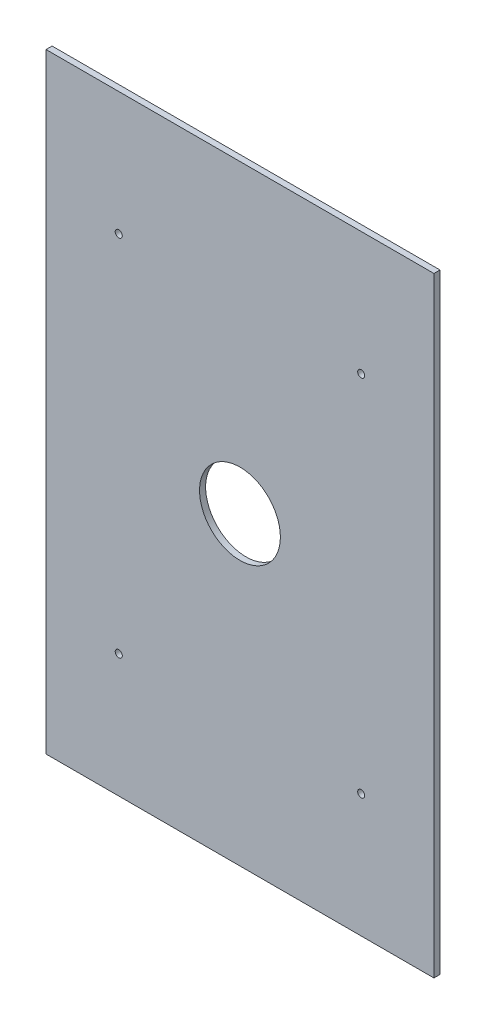
ISO-10303-21;
HEADER;
FILE_DESCRIPTION(('STEP AP214'),'2;1');
FILE_NAME('part.step','',(''),(''),'','','');
FILE_SCHEMA(('AUTOMOTIVE_DESIGN { 1 0 10303 214 1 1 1 1 }'));
ENDSEC;
DATA;
#1=APPLICATION_CONTEXT('core data for automotive mechanical design processes');
#2=APPLICATION_PROTOCOL_DEFINITION('international standard','automotive_design',2000,#1);
#3=PRODUCT_CONTEXT('',#1,'mechanical');
#4=PRODUCT('Part','Part','',(#3));
#5=PRODUCT_RELATED_PRODUCT_CATEGORY('part','',(#4));
#6=PRODUCT_DEFINITION_FORMATION('','',#4);
#7=PRODUCT_DEFINITION_CONTEXT('part definition',#1,'design');
#8=PRODUCT_DEFINITION('design','',#6,#7);
#9=PRODUCT_DEFINITION_SHAPE('','',#8);
#10=(LENGTH_UNIT() NAMED_UNIT(*) SI_UNIT(.MILLI.,.METRE.));
#11=(NAMED_UNIT(*) PLANE_ANGLE_UNIT() SI_UNIT($,.RADIAN.));
#12=(NAMED_UNIT(*) SI_UNIT($,.STERADIAN.) SOLID_ANGLE_UNIT());
#13=UNCERTAINTY_MEASURE_WITH_UNIT(LENGTH_MEASURE(1.E-05),#10,'distance_accuracy_value','');
#14=(GEOMETRIC_REPRESENTATION_CONTEXT(3) GLOBAL_UNCERTAINTY_ASSIGNED_CONTEXT((#13)) GLOBAL_UNIT_ASSIGNED_CONTEXT((#10,
#11,#12)) REPRESENTATION_CONTEXT('',''));
#15=CARTESIAN_POINT('',(0.,0.,0.));
#16=DIRECTION('',(0.,0.,1.));
#17=DIRECTION('',(1.,0.,0.));
#18=AXIS2_PLACEMENT_3D('',#15,#16,#17);
#19=CARTESIAN_POINT('',(0.,604.,6.));
#20=DIRECTION('',(1.,0.,0.));
#21=DIRECTION('',(0.,0.,-1.));
#22=AXIS2_PLACEMENT_3D('',#19,#20,#21);
#23=PLANE('',#22);
#24=DIRECTION('',(0.,-1.,0.));
#25=VECTOR('',#24,1.);
#26=CARTESIAN_POINT('',(0.,604.,0.));
#27=LINE('',#26,#25);
#28=CARTESIAN_POINT('',(0.,604.,0.));
#29=VERTEX_POINT('',#28);
#30=CARTESIAN_POINT('',(0.,0.,0.));
#31=VERTEX_POINT('',#30);
#32=EDGE_CURVE('E102',#29,#31,#27,.T.);
#33=ORIENTED_EDGE('',*,*,#32,.T.);
#34=DIRECTION('',(0.,0.,-1.));
#35=VECTOR('',#34,1.);
#36=CARTESIAN_POINT('',(0.,0.,6.));
#37=LINE('',#36,#35);
#38=CARTESIAN_POINT('',(0.,0.,6.));
#39=VERTEX_POINT('',#38);
#40=EDGE_CURVE('E11',#39,#31,#37,.T.);
#41=ORIENTED_EDGE('',*,*,#40,.F.);
#42=DIRECTION('',(0.,-1.,0.));
#43=VECTOR('',#42,1.);
#44=CARTESIAN_POINT('',(0.,604.,6.));
#45=LINE('',#44,#43);
#46=CARTESIAN_POINT('',(0.,604.,6.));
#47=VERTEX_POINT('',#46);
#48=EDGE_CURVE('E90',#47,#39,#45,.T.);
#49=ORIENTED_EDGE('',*,*,#48,.F.);
#50=DIRECTION('',(0.,0.,-1.));
#51=VECTOR('',#50,1.);
#52=CARTESIAN_POINT('',(0.,604.,6.));
#53=LINE('',#52,#51);
#54=EDGE_CURVE('E98',#47,#29,#53,.T.);
#55=ORIENTED_EDGE('',*,*,#54,.T.);
#56=EDGE_LOOP('',(#33,#41,#49,#55));
#57=FACE_BOUND('',#56,.T.);
#58=ADVANCED_FACE('F39',(#57),#23,.F.);
#59=CARTESIAN_POINT('',(0.,0.,6.));
#60=DIRECTION('',(0.,1.,0.));
#61=DIRECTION('',(0.,0.,1.));
#62=AXIS2_PLACEMENT_3D('',#59,#60,#61);
#63=PLANE('',#62);
#64=DIRECTION('',(1.,0.,0.));
#65=VECTOR('',#64,1.);
#66=CARTESIAN_POINT('',(0.,0.,0.));
#67=LINE('',#66,#65);
#68=CARTESIAN_POINT('',(384.,0.,0.));
#69=VERTEX_POINT('',#68);
#70=EDGE_CURVE('E94',#31,#69,#67,.T.);
#71=ORIENTED_EDGE('',*,*,#70,.T.);
#72=DIRECTION('',(0.,0.,-1.));
#73=VECTOR('',#72,1.);
#74=CARTESIAN_POINT('',(384.,0.,6.));
#75=LINE('',#74,#73);
#76=CARTESIAN_POINT('',(384.,0.,6.));
#77=VERTEX_POINT('',#76);
#78=EDGE_CURVE('E47',#77,#69,#75,.T.);
#79=ORIENTED_EDGE('',*,*,#78,.F.);
#80=DIRECTION('',(1.,0.,0.));
#81=VECTOR('',#80,1.);
#82=CARTESIAN_POINT('',(0.,0.,6.));
#83=LINE('',#82,#81);
#84=EDGE_CURVE('E85',#39,#77,#83,.T.);
#85=ORIENTED_EDGE('',*,*,#84,.F.);
#86=ORIENTED_EDGE('',*,*,#40,.T.);
#87=EDGE_LOOP('',(#71,#79,#85,#86));
#88=FACE_BOUND('',#87,.T.);
#89=ADVANCED_FACE('F93',(#88),#63,.F.);
#90=CARTESIAN_POINT('',(384.,0.,6.));
#91=DIRECTION('',(-1.,0.,0.));
#92=DIRECTION('',(0.,0.,1.));
#93=AXIS2_PLACEMENT_3D('',#90,#91,#92);
#94=PLANE('',#93);
#95=DIRECTION('',(0.,1.,0.));
#96=VECTOR('',#95,1.);
#97=CARTESIAN_POINT('',(384.,0.,0.));
#98=LINE('',#97,#96);
#99=CARTESIAN_POINT('',(384.,604.,0.));
#100=VERTEX_POINT('',#99);
#101=EDGE_CURVE('E72',#69,#100,#98,.T.);
#102=ORIENTED_EDGE('',*,*,#101,.T.);
#103=DIRECTION('',(0.,0.,-1.));
#104=VECTOR('',#103,1.);
#105=CARTESIAN_POINT('',(384.,604.,6.));
#106=LINE('',#105,#104);
#107=CARTESIAN_POINT('',(384.,604.,6.));
#108=VERTEX_POINT('',#107);
#109=EDGE_CURVE('E95',#108,#100,#106,.T.);
#110=ORIENTED_EDGE('',*,*,#109,.F.);
#111=DIRECTION('',(0.,1.,0.));
#112=VECTOR('',#111,1.);
#113=CARTESIAN_POINT('',(384.,0.,6.));
#114=LINE('',#113,#112);
#115=EDGE_CURVE('E88',#77,#108,#114,.T.);
#116=ORIENTED_EDGE('',*,*,#115,.F.);
#117=ORIENTED_EDGE('',*,*,#78,.T.);
#118=EDGE_LOOP('',(#102,#110,#116,#117));
#119=FACE_BOUND('',#118,.T.);
#120=ADVANCED_FACE('F96',(#119),#94,.F.);
#121=CARTESIAN_POINT('',(384.,604.,6.));
#122=DIRECTION('',(0.,-1.,0.));
#123=DIRECTION('',(0.,0.,-1.));
#124=AXIS2_PLACEMENT_3D('',#121,#122,#123);
#125=PLANE('',#124);
#126=DIRECTION('',(-1.,0.,0.));
#127=VECTOR('',#126,1.);
#128=CARTESIAN_POINT('',(384.,604.,0.));
#129=LINE('',#128,#127);
#130=EDGE_CURVE('E78',#100,#29,#129,.T.);
#131=ORIENTED_EDGE('',*,*,#130,.T.);
#132=ORIENTED_EDGE('',*,*,#54,.F.);
#133=DIRECTION('',(-1.,0.,0.));
#134=VECTOR('',#133,1.);
#135=CARTESIAN_POINT('',(384.,604.,6.));
#136=LINE('',#135,#134);
#137=EDGE_CURVE('E55',#108,#47,#136,.T.);
#138=ORIENTED_EDGE('',*,*,#137,.F.);
#139=ORIENTED_EDGE('',*,*,#109,.T.);
#140=EDGE_LOOP('',(#131,#132,#138,#139));
#141=FACE_BOUND('',#140,.T.);
#142=ADVANCED_FACE('F110',(#141),#125,.F.);
#143=CARTESIAN_POINT('',(0.,0.,6.));
#144=DIRECTION('',(0.,0.,1.));
#145=DIRECTION('',(1.,0.,0.));
#146=AXIS2_PLACEMENT_3D('',#143,#144,#145);
#147=PLANE('',#146);
#148=CARTESIAN_POINT('',(312.,482.,6.));
#149=DIRECTION('',(0.,0.,1.));
#150=DIRECTION('',(1.,0.,0.));
#151=AXIS2_PLACEMENT_3D('',#148,#149,#150);
#152=CIRCLE('',#151,3.5);
#153=CARTESIAN_POINT('',(315.5,482.,6.));
#154=VERTEX_POINT('',#153);
#155=EDGE_CURVE('E140',#154,#154,#152,.T.);
#156=ORIENTED_EDGE('',*,*,#155,.F.);
#157=EDGE_LOOP('',(#156));
#158=FACE_BOUND('',#157,.T.);
#159=CARTESIAN_POINT('',(312.,122.,6.));
#160=DIRECTION('',(0.,0.,1.));
#161=DIRECTION('',(1.,0.,0.));
#162=AXIS2_PLACEMENT_3D('',#159,#160,#161);
#163=CIRCLE('',#162,3.5);
#164=CARTESIAN_POINT('',(315.5,122.,6.));
#165=VERTEX_POINT('',#164);
#166=EDGE_CURVE('E134',#165,#165,#163,.T.);
#167=ORIENTED_EDGE('',*,*,#166,.F.);
#168=EDGE_LOOP('',(#167));
#169=FACE_BOUND('',#168,.T.);
#170=CARTESIAN_POINT('',(72.,482.,6.));
#171=DIRECTION('',(0.,0.,1.));
#172=DIRECTION('',(1.,0.,0.));
#173=AXIS2_PLACEMENT_3D('',#170,#171,#172);
#174=CIRCLE('',#173,3.5);
#175=CARTESIAN_POINT('',(75.5,482.,6.));
#176=VERTEX_POINT('',#175);
#177=EDGE_CURVE('E128',#176,#176,#174,.T.);
#178=ORIENTED_EDGE('',*,*,#177,.F.);
#179=EDGE_LOOP('',(#178));
#180=FACE_BOUND('',#179,.T.);
#181=CARTESIAN_POINT('',(72.,122.,6.));
#182=DIRECTION('',(0.,0.,1.));
#183=DIRECTION('',(1.,0.,0.));
#184=AXIS2_PLACEMENT_3D('',#181,#182,#183);
#185=CIRCLE('',#184,3.5);
#186=CARTESIAN_POINT('',(75.5,122.,6.));
#187=VERTEX_POINT('',#186);
#188=EDGE_CURVE('E122',#187,#187,#185,.T.);
#189=ORIENTED_EDGE('',*,*,#188,.F.);
#190=EDGE_LOOP('',(#189));
#191=FACE_BOUND('',#190,.T.);
#192=CARTESIAN_POINT('',(192.,302.,6.));
#193=DIRECTION('',(0.,0.,1.));
#194=DIRECTION('',(1.,0.,0.));
#195=AXIS2_PLACEMENT_3D('',#192,#193,#194);
#196=CIRCLE('',#195,40.);
#197=CARTESIAN_POINT('',(232.,302.,6.));
#198=VERTEX_POINT('',#197);
#199=EDGE_CURVE('E116',#198,#198,#196,.T.);
#200=ORIENTED_EDGE('',*,*,#199,.F.);
#201=EDGE_LOOP('',(#200));
#202=FACE_BOUND('',#201,.T.);
#203=ORIENTED_EDGE('',*,*,#48,.T.);
#204=ORIENTED_EDGE('',*,*,#84,.T.);
#205=ORIENTED_EDGE('',*,*,#115,.T.);
#206=ORIENTED_EDGE('',*,*,#137,.T.);
#207=EDGE_LOOP('',(#203,#204,#205,#206));
#208=FACE_BOUND('',#207,.T.);
#209=ADVANCED_FACE('F86',(#158,#169,#180,#191,#202,#208),#147,.T.);
#210=CARTESIAN_POINT('',(0.,0.,0.));
#211=DIRECTION('',(0.,0.,1.));
#212=DIRECTION('',(1.,0.,0.));
#213=AXIS2_PLACEMENT_3D('',#210,#211,#212);
#214=PLANE('',#213);
#215=CARTESIAN_POINT('',(312.,482.,0.));
#216=DIRECTION('',(0.,0.,1.));
#217=DIRECTION('',(1.,0.,0.));
#218=AXIS2_PLACEMENT_3D('',#215,#216,#217);
#219=CIRCLE('',#218,3.5);
#220=CARTESIAN_POINT('',(315.5,482.,0.));
#221=VERTEX_POINT('',#220);
#222=EDGE_CURVE('E137',#221,#221,#219,.T.);
#223=ORIENTED_EDGE('',*,*,#222,.T.);
#224=EDGE_LOOP('',(#223));
#225=FACE_BOUND('',#224,.T.);
#226=CARTESIAN_POINT('',(312.,122.,0.));
#227=DIRECTION('',(0.,0.,1.));
#228=DIRECTION('',(1.,0.,0.));
#229=AXIS2_PLACEMENT_3D('',#226,#227,#228);
#230=CIRCLE('',#229,3.5);
#231=CARTESIAN_POINT('',(315.5,122.,0.));
#232=VERTEX_POINT('',#231);
#233=EDGE_CURVE('E131',#232,#232,#230,.T.);
#234=ORIENTED_EDGE('',*,*,#233,.T.);
#235=EDGE_LOOP('',(#234));
#236=FACE_BOUND('',#235,.T.);
#237=CARTESIAN_POINT('',(72.,482.,0.));
#238=DIRECTION('',(0.,0.,1.));
#239=DIRECTION('',(1.,0.,0.));
#240=AXIS2_PLACEMENT_3D('',#237,#238,#239);
#241=CIRCLE('',#240,3.5);
#242=CARTESIAN_POINT('',(75.5,482.,0.));
#243=VERTEX_POINT('',#242);
#244=EDGE_CURVE('E125',#243,#243,#241,.T.);
#245=ORIENTED_EDGE('',*,*,#244,.T.);
#246=EDGE_LOOP('',(#245));
#247=FACE_BOUND('',#246,.T.);
#248=CARTESIAN_POINT('',(72.,122.,0.));
#249=DIRECTION('',(0.,0.,1.));
#250=DIRECTION('',(1.,0.,0.));
#251=AXIS2_PLACEMENT_3D('',#248,#249,#250);
#252=CIRCLE('',#251,3.5);
#253=CARTESIAN_POINT('',(75.5,122.,0.));
#254=VERTEX_POINT('',#253);
#255=EDGE_CURVE('E119',#254,#254,#252,.T.);
#256=ORIENTED_EDGE('',*,*,#255,.T.);
#257=EDGE_LOOP('',(#256));
#258=FACE_BOUND('',#257,.T.);
#259=CARTESIAN_POINT('',(192.,302.,0.));
#260=DIRECTION('',(0.,0.,1.));
#261=DIRECTION('',(1.,0.,0.));
#262=AXIS2_PLACEMENT_3D('',#259,#260,#261);
#263=CIRCLE('',#262,40.);
#264=CARTESIAN_POINT('',(232.,302.,0.));
#265=VERTEX_POINT('',#264);
#266=EDGE_CURVE('E105',#265,#265,#263,.T.);
#267=ORIENTED_EDGE('',*,*,#266,.T.);
#268=EDGE_LOOP('',(#267));
#269=FACE_BOUND('',#268,.T.);
#270=ORIENTED_EDGE('',*,*,#32,.F.);
#271=ORIENTED_EDGE('',*,*,#130,.F.);
#272=ORIENTED_EDGE('',*,*,#101,.F.);
#273=ORIENTED_EDGE('',*,*,#70,.F.);
#274=EDGE_LOOP('',(#270,#271,#272,#273));
#275=FACE_BOUND('',#274,.T.);
#276=ADVANCED_FACE('F113',(#225,#236,#247,#258,#269,#275),#214,.F.);
#277=CARTESIAN_POINT('',(192.,302.,0.));
#278=DIRECTION('',(0.,0.,1.));
#279=DIRECTION('',(1.,0.,0.));
#280=AXIS2_PLACEMENT_3D('',#277,#278,#279);
#281=CYLINDRICAL_SURFACE('',#280,40.);
#282=ORIENTED_EDGE('',*,*,#266,.F.);
#283=EDGE_LOOP('',(#282));
#284=FACE_BOUND('',#283,.T.);
#285=ORIENTED_EDGE('',*,*,#199,.T.);
#286=EDGE_LOOP('',(#285));
#287=FACE_BOUND('',#286,.T.);
#288=ADVANCED_FACE('F166',(#284,#287),#281,.F.);
#289=CARTESIAN_POINT('',(72.,122.,0.));
#290=DIRECTION('',(0.,0.,1.));
#291=DIRECTION('',(1.,0.,0.));
#292=AXIS2_PLACEMENT_3D('',#289,#290,#291);
#293=CYLINDRICAL_SURFACE('',#292,3.5);
#294=ORIENTED_EDGE('',*,*,#255,.F.);
#295=EDGE_LOOP('',(#294));
#296=FACE_BOUND('',#295,.T.);
#297=ORIENTED_EDGE('',*,*,#188,.T.);
#298=EDGE_LOOP('',(#297));
#299=FACE_BOUND('',#298,.T.);
#300=ADVANCED_FACE('F168',(#296,#299),#293,.F.);
#301=CARTESIAN_POINT('',(72.,482.,0.));
#302=DIRECTION('',(0.,0.,1.));
#303=DIRECTION('',(1.,0.,0.));
#304=AXIS2_PLACEMENT_3D('',#301,#302,#303);
#305=CYLINDRICAL_SURFACE('',#304,3.5);
#306=ORIENTED_EDGE('',*,*,#244,.F.);
#307=EDGE_LOOP('',(#306));
#308=FACE_BOUND('',#307,.T.);
#309=ORIENTED_EDGE('',*,*,#177,.T.);
#310=EDGE_LOOP('',(#309));
#311=FACE_BOUND('',#310,.T.);
#312=ADVANCED_FACE('F175',(#308,#311),#305,.F.);
#313=CARTESIAN_POINT('',(312.,122.,0.));
#314=DIRECTION('',(0.,0.,1.));
#315=DIRECTION('',(1.,0.,0.));
#316=AXIS2_PLACEMENT_3D('',#313,#314,#315);
#317=CYLINDRICAL_SURFACE('',#316,3.5);
#318=ORIENTED_EDGE('',*,*,#233,.F.);
#319=EDGE_LOOP('',(#318));
#320=FACE_BOUND('',#319,.T.);
#321=ORIENTED_EDGE('',*,*,#166,.T.);
#322=EDGE_LOOP('',(#321));
#323=FACE_BOUND('',#322,.T.);
#324=ADVANCED_FACE('F151',(#320,#323),#317,.F.);
#325=CARTESIAN_POINT('',(312.,482.,0.));
#326=DIRECTION('',(0.,0.,1.));
#327=DIRECTION('',(1.,0.,0.));
#328=AXIS2_PLACEMENT_3D('',#325,#326,#327);
#329=CYLINDRICAL_SURFACE('',#328,3.5);
#330=ORIENTED_EDGE('',*,*,#222,.F.);
#331=EDGE_LOOP('',(#330));
#332=FACE_BOUND('',#331,.T.);
#333=ORIENTED_EDGE('',*,*,#155,.T.);
#334=EDGE_LOOP('',(#333));
#335=FACE_BOUND('',#334,.T.);
#336=ADVANCED_FACE('F148',(#332,#335),#329,.F.);
#337=CLOSED_SHELL('',(#58,#89,#120,#142,#209,#276,#288,#300,#312,#324,#336));
#338=MANIFOLD_SOLID_BREP('B2',#337);
#339=ADVANCED_BREP_SHAPE_REPRESENTATION('',(#18,#338),#14);
#340=SHAPE_DEFINITION_REPRESENTATION(#9,#339);
ENDSEC;
END-ISO-10303-21;
